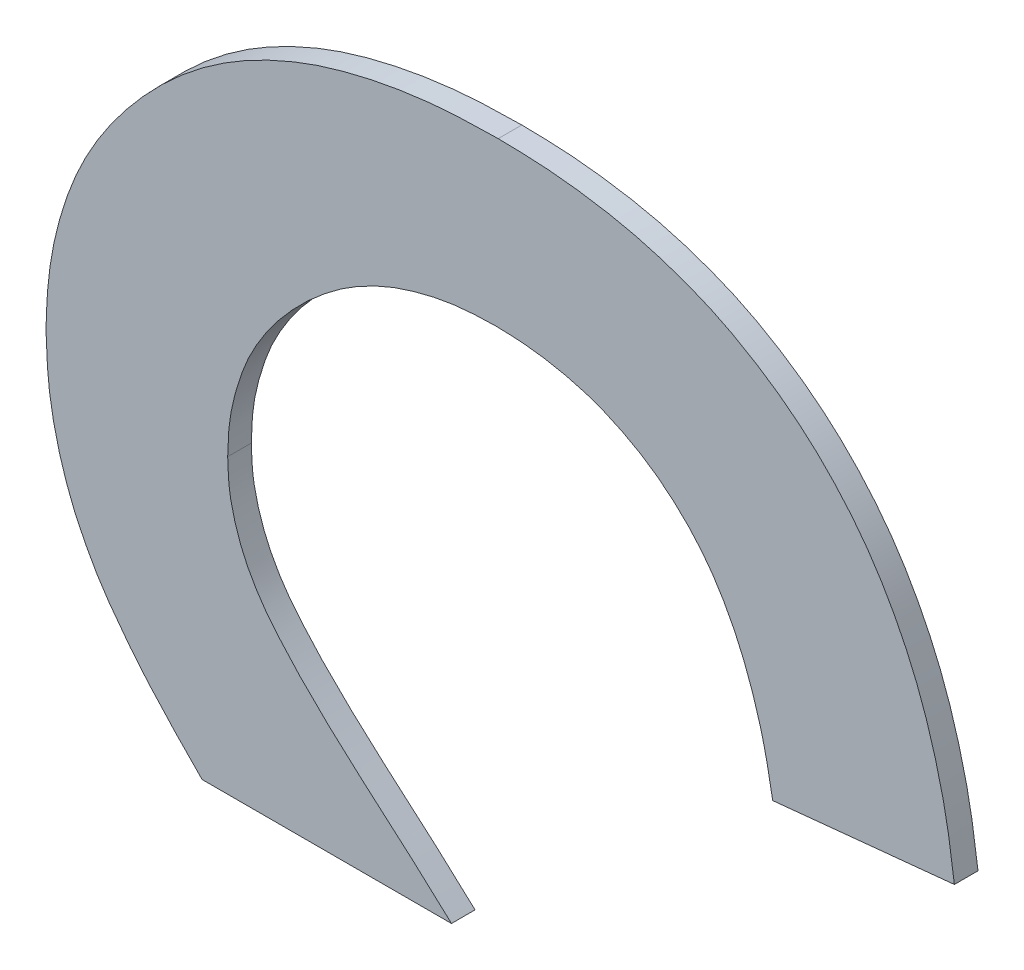
ISO-10303-21;
HEADER;
FILE_DESCRIPTION(('STEP AP214'),'2;1');
FILE_NAME('part.step','',(''),(''),'','','');
FILE_SCHEMA(('AUTOMOTIVE_DESIGN { 1 0 10303 214 1 1 1 1 }'));
ENDSEC;
DATA;
#1=APPLICATION_CONTEXT('core data for automotive mechanical design processes');
#2=APPLICATION_PROTOCOL_DEFINITION('international standard','automotive_design',2000,#1);
#3=PRODUCT_CONTEXT('',#1,'mechanical');
#4=PRODUCT('Part','Part','',(#3));
#5=PRODUCT_RELATED_PRODUCT_CATEGORY('part','',(#4));
#6=PRODUCT_DEFINITION_FORMATION('','',#4);
#7=PRODUCT_DEFINITION_CONTEXT('part definition',#1,'design');
#8=PRODUCT_DEFINITION('design','',#6,#7);
#9=PRODUCT_DEFINITION_SHAPE('','',#8);
#10=(LENGTH_UNIT() NAMED_UNIT(*) SI_UNIT(.MILLI.,.METRE.));
#11=(NAMED_UNIT(*) PLANE_ANGLE_UNIT() SI_UNIT($,.RADIAN.));
#12=(NAMED_UNIT(*) SI_UNIT($,.STERADIAN.) SOLID_ANGLE_UNIT());
#13=UNCERTAINTY_MEASURE_WITH_UNIT(LENGTH_MEASURE(1.E-05),#10,'distance_accuracy_value','');
#14=(GEOMETRIC_REPRESENTATION_CONTEXT(3) GLOBAL_UNCERTAINTY_ASSIGNED_CONTEXT((#13)) GLOBAL_UNIT_ASSIGNED_CONTEXT((#10,
#11,#12)) REPRESENTATION_CONTEXT('',''));
#15=CARTESIAN_POINT('',(0.,0.,0.));
#16=DIRECTION('',(0.,0.,1.));
#17=DIRECTION('',(1.,0.,0.));
#18=AXIS2_PLACEMENT_3D('',#15,#16,#17);
#19=CARTESIAN_POINT('',(0.174278846153862,-0.727163461538463,0.5));
#20=CARTESIAN_POINT('',(0.104379550291745,-0.648850490465537,0.5));
#21=CARTESIAN_POINT('',(-0.045742355823704,-0.480658631791847,0.5));
#22=CARTESIAN_POINT('',(-0.29113487059763,-0.215189631286869,0.5));
#23=CARTESIAN_POINT('',(-0.580472868697672,0.0706440784369072,0.5));
#24=CARTESIAN_POINT('',(-0.904826844471692,0.383369833470368,0.5));
#25=CARTESIAN_POINT('',(-1.26786361250698,0.721514611585081,0.5));
#26=CARTESIAN_POINT('',(-1.66886042913075,1.08573545993146,0.5));
#27=CARTESIAN_POINT('',(-2.10733499095428,1.47898015973117,0.5));
#28=CARTESIAN_POINT('',(-2.57996236240517,1.87862434507439,0.5));
#29=CARTESIAN_POINT('',(-3.03989044013833,2.29050165337768,0.5));
#30=CARTESIAN_POINT('',(-3.47745383321435,2.67992913892365,0.5));
#31=CARTESIAN_POINT('',(-3.86587046467265,3.05310426266962,0.5));
#32=CARTESIAN_POINT('',(-4.21554668744453,3.39885295343115,0.5));
#33=CARTESIAN_POINT('',(-4.51686073317424,3.72496446556832,0.5));
#34=CARTESIAN_POINT('',(-4.77576595325133,4.02530742447659,0.5));
#35=CARTESIAN_POINT('',(-4.99460510227963,4.29918836186116,0.5));
#36=CARTESIAN_POINT('',(-5.2191179143057,4.63819307085225,0.5));
#37=CARTESIAN_POINT('',(-5.44355125811733,5.05586246312233,0.5));
#38=CARTESIAN_POINT('',(-5.63023139592506,5.58066146372215,0.5));
#39=CARTESIAN_POINT('',(-5.75092532088114,6.12630622043596,0.5));
#40=CARTESIAN_POINT('',(-5.76308090749268,6.49976059002287,0.5));
#41=CARTESIAN_POINT('',(-5.76923076923075,6.68870192307692,0.5));
#42=B_SPLINE_CURVE_WITH_KNOTS('',3,(#19,#20,#21,#22,#23,#24,#25,#26,#27,#28,#29,#30,#31,#32,#33,
#34,#35,#36,#37,#38,#39,#40,#41),.UNSPECIFIED.,.F.,.F.,(4,1,1,1,1,1,1,1,1,1,1,1,1,1,1,1,1,1,1,1,
4),(0.,0.0322310690575655,0.0692222927768105,0.110974619220364,0.157084351643919,
0.207565065006248,0.263295960672411,0.323415696376189,0.388395141471602,0.453316340369315,
0.512978116543887,0.568228373472554,0.618679101258514,0.663944231265397,0.704506211403094,
0.740433873332112,0.771481196059508,0.829261763324265,0.885489376099478,0.942065773785035,1.),.UNSPECIFIED.);
#43=DIRECTION('',(0.,0.,-1.));
#44=VECTOR('',#43,1.);
#45=SURFACE_OF_LINEAR_EXTRUSION('',#42,#44);
#46=CARTESIAN_POINT('',(-1.030645565602,0.500000000006745,0.5));
#47=VERTEX_POINT('',#46);
#48=CARTESIAN_POINT('',(-5.76923076923075,6.68870192307692,0.5));
#49=VERTEX_POINT('',#48);
#50=EDGE_CURVE('E125',#47,#49,#42,.T.);
#51=ORIENTED_EDGE('',*,*,#50,.F.);
#52=DIRECTION('',(0.,0.,-1.));
#53=VECTOR('',#52,1.);
#54=CARTESIAN_POINT('',(-1.03064556559479,0.5,0.5));
#55=LINE('',#54,#53);
#56=CARTESIAN_POINT('',(-1.03207646711453,0.5,-1.2E-05));
#57=VERTEX_POINT('',#56);
#58=EDGE_CURVE('E57',#47,#57,#55,.T.);
#59=ORIENTED_EDGE('',*,*,#58,.T.);
#60=CARTESIAN_POINT('',(0.174278846153862,-0.727163461538463,0.));
#61=CARTESIAN_POINT('',(0.104379550291745,-0.648850490465537,0.));
#62=CARTESIAN_POINT('',(-0.045742355823704,-0.480658631791847,0.));
#63=CARTESIAN_POINT('',(-0.29113487059763,-0.215189631286869,0.));
#64=CARTESIAN_POINT('',(-0.580472868697672,0.0706440784369072,0.));
#65=CARTESIAN_POINT('',(-0.904826844471692,0.383369833470368,0.));
#66=CARTESIAN_POINT('',(-1.26786361250698,0.721514611585081,0.));
#67=CARTESIAN_POINT('',(-1.66886042913075,1.08573545993146,0.));
#68=CARTESIAN_POINT('',(-2.10733499095428,1.47898015973117,0.));
#69=CARTESIAN_POINT('',(-2.57996236240517,1.87862434507439,0.));
#70=CARTESIAN_POINT('',(-3.03989044013833,2.29050165337768,0.));
#71=CARTESIAN_POINT('',(-3.47745383321435,2.67992913892365,0.));
#72=CARTESIAN_POINT('',(-3.86587046467265,3.05310426266962,0.));
#73=CARTESIAN_POINT('',(-4.21554668744453,3.39885295343115,0.));
#74=CARTESIAN_POINT('',(-4.51686073317424,3.72496446556832,0.));
#75=CARTESIAN_POINT('',(-4.77576595325133,4.02530742447659,0.));
#76=CARTESIAN_POINT('',(-4.99460510227963,4.29918836186116,0.));
#77=CARTESIAN_POINT('',(-5.2191179143057,4.63819307085225,0.));
#78=CARTESIAN_POINT('',(-5.44355125811733,5.05586246312233,0.));
#79=CARTESIAN_POINT('',(-5.63023139592506,5.58066146372215,0.));
#80=CARTESIAN_POINT('',(-5.75092532088114,6.12630622043596,0.));
#81=CARTESIAN_POINT('',(-5.76308090749268,6.49976059002287,0.));
#82=CARTESIAN_POINT('',(-5.76923076923075,6.68870192307692,0.));
#83=B_SPLINE_CURVE_WITH_KNOTS('',3,(#60,#61,#62,#63,#64,#65,#66,#67,#68,#69,#70,#71,#72,#73,#74,
#75,#76,#77,#78,#79,#80,#81,#82),.UNSPECIFIED.,.F.,.F.,(4,1,1,1,1,1,1,1,1,1,1,1,1,1,1,1,1,1,1,1,
4),(0.,0.0322310690575655,0.0692222927768105,0.110974619220364,0.157084351643919,
0.207565065006248,0.263295960672411,0.323415696376189,0.388395141471602,0.453316340369315,
0.512978116543887,0.568228373472554,0.618679101258514,0.663944231265397,0.704506211403094,
0.740433873332112,0.771481196059508,0.829261763324265,0.885489376099478,0.942065773785035,1.),.UNSPECIFIED.);
#84=CARTESIAN_POINT('',(-5.76923076923075,6.68870192307692,0.));
#85=VERTEX_POINT('',#84);
#86=EDGE_CURVE('E114',#57,#85,#83,.T.);
#87=ORIENTED_EDGE('',*,*,#86,.T.);
#88=DIRECTION('',(0.,0.,-1.));
#89=VECTOR('',#88,1.);
#90=CARTESIAN_POINT('',(-5.76923076923075,6.68870192307692,0.5));
#91=LINE('',#90,#89);
#92=EDGE_CURVE('E137',#49,#85,#91,.T.);
#93=ORIENTED_EDGE('',*,*,#92,.F.);
#94=EDGE_LOOP('',(#51,#59,#87,#93));
#95=FACE_BOUND('',#94,.T.);
#96=ADVANCED_FACE('F39',(#95),#45,.F.);
#97=CARTESIAN_POINT('',(-9.6153846153846,7.08533653846154,0.5));
#98=CARTESIAN_POINT('',(-9.60389301856012,6.75797579590921,0.5));
#99=CARTESIAN_POINT('',(-9.58123590042242,6.11254321321944,0.5));
#100=CARTESIAN_POINT('',(-9.39918084325723,5.16596193693734,0.5));
#101=CARTESIAN_POINT('',(-9.11340108879337,4.25680371032432,0.5));
#102=CARTESIAN_POINT('',(-8.7639340038743,3.53368819405655,0.5));
#103=CARTESIAN_POINT('',(-8.42372985010389,2.95682003936723,0.5));
#104=CARTESIAN_POINT('',(-8.09929652395903,2.50973408455943,0.5));
#105=CARTESIAN_POINT('',(-7.73327862909316,2.0308320673421,0.5));
#106=CARTESIAN_POINT('',(-7.30446324529288,1.53271603087338,0.5));
#107=CARTESIAN_POINT('',(-6.81678447837605,1.01401065917077,0.5));
#108=CARTESIAN_POINT('',(-6.28127267708572,0.463462546866536,0.5));
#109=CARTESIAN_POINT('',(-5.68757216973112,-0.105316940384008,0.5));
#110=CARTESIAN_POINT('',(-5.26553019510752,-0.48398254488782,0.5));
#111=CARTESIAN_POINT('',(-5.04807692307691,-0.67908653846154,0.5));
#112=B_SPLINE_CURVE_WITH_KNOTS('',3,(#97,#98,#99,#100,#101,#102,#103,#104,#105,#106,#107,#108,
#109,#110,#111),.UNSPECIFIED.,.F.,.F.,(4,1,1,1,1,1,1,1,1,1,1,1,4),(0.,0.105240132868083,
0.207494063674428,0.308987716506333,0.411030235834405,0.465074341040456,0.524257047302949,
0.588577825583629,0.658965763752887,0.73556935018822,0.817597390457212,0.906018721698534,1.),.UNSPECIFIED.);
#113=DIRECTION('',(0.,0.,-1.));
#114=VECTOR('',#113,1.);
#115=SURFACE_OF_LINEAR_EXTRUSION('',#112,#114);
#116=CARTESIAN_POINT('',(-9.6153846153846,7.08533653846154,0.));
#117=CARTESIAN_POINT('',(-9.60389301856012,6.75797579590921,0.));
#118=CARTESIAN_POINT('',(-9.58123590042242,6.11254321321944,0.));
#119=CARTESIAN_POINT('',(-9.39918084325723,5.16596193693734,0.));
#120=CARTESIAN_POINT('',(-9.11340108879337,4.25680371032432,0.));
#121=CARTESIAN_POINT('',(-8.7639340038743,3.53368819405655,0.));
#122=CARTESIAN_POINT('',(-8.42372985010389,2.95682003936723,0.));
#123=CARTESIAN_POINT('',(-8.09929652395903,2.50973408455943,0.));
#124=CARTESIAN_POINT('',(-7.73327862909316,2.0308320673421,0.));
#125=CARTESIAN_POINT('',(-7.30446324529288,1.53271603087338,0.));
#126=CARTESIAN_POINT('',(-6.81678447837605,1.01401065917077,0.));
#127=CARTESIAN_POINT('',(-6.28127267708572,0.463462546866536,0.));
#128=CARTESIAN_POINT('',(-5.68757216973112,-0.105316940384008,0.));
#129=CARTESIAN_POINT('',(-5.26553019510752,-0.48398254488782,0.));
#130=CARTESIAN_POINT('',(-5.04807692307691,-0.67908653846154,0.));
#131=B_SPLINE_CURVE_WITH_KNOTS('',3,(#116,#117,#118,#119,#120,#121,#122,#123,#124,#125,#126,
#127,#128,#129,#130),.UNSPECIFIED.,.F.,.F.,(4,1,1,1,1,1,1,1,1,1,1,1,4),(0.,0.105240132868083,
0.207494063674428,0.308987716506333,0.411030235834405,0.465074341040456,0.524257047302949,
0.588577825583629,0.658965763752887,0.73556935018822,0.817597390457212,0.906018721698534,1.),.UNSPECIFIED.);
#132=CARTESIAN_POINT('',(-9.6153846153846,7.08533653846154,0.));
#133=VERTEX_POINT('',#132);
#134=CARTESIAN_POINT('',(-6.31139575756182,0.50000000013606,0.));
#135=VERTEX_POINT('',#134);
#136=EDGE_CURVE('E109',#133,#135,#131,.T.);
#137=ORIENTED_EDGE('',*,*,#136,.T.);
#138=DIRECTION('',(0.,0.,-1.));
#139=VECTOR('',#138,1.);
#140=CARTESIAN_POINT('',(-6.31139575742523,0.500000000000001,0.5));
#141=LINE('',#140,#139);
#142=CARTESIAN_POINT('',(-6.31139576715313,0.5,0.5));
#143=VERTEX_POINT('',#142);
#144=EDGE_CURVE('E98',#135,#143,#141,.F.);
#145=ORIENTED_EDGE('',*,*,#144,.T.);
#146=CARTESIAN_POINT('',(-9.6153846153846,7.08533653846154,0.5));
#147=VERTEX_POINT('',#146);
#148=EDGE_CURVE('E159',#147,#143,#112,.T.);
#149=ORIENTED_EDGE('',*,*,#148,.F.);
#150=DIRECTION('',(0.,0.,-1.));
#151=VECTOR('',#150,1.);
#152=CARTESIAN_POINT('',(-9.6153846153846,7.08533653846154,0.5));
#153=LINE('',#152,#151);
#154=EDGE_CURVE('E107',#147,#133,#153,.T.);
#155=ORIENTED_EDGE('',*,*,#154,.T.);
#156=EDGE_LOOP('',(#137,#145,#149,#155));
#157=FACE_BOUND('',#156,.T.);
#158=ADVANCED_FACE('F117',(#157),#115,.F.);
#159=CARTESIAN_POINT('',(2.31824117430215,-7.51504795191898,0.5));
#160=DIRECTION('',(0.,0.,-1.));
#161=DIRECTION('',(-1.,0.,0.));
#162=AXIS2_PLACEMENT_3D('',#159,#160,#161);
#163=PLANE('',#162);
#164=ORIENTED_EDGE('',*,*,#148,.T.);
#165=DIRECTION('',(1.,0.,0.));
#166=VECTOR('',#165,1.);
#167=CARTESIAN_POINT('',(2.31824117430215,0.5,0.5));
#168=LINE('',#167,#166);
#169=EDGE_CURVE('E100',#143,#47,#168,.T.);
#170=ORIENTED_EDGE('',*,*,#169,.T.);
#171=ORIENTED_EDGE('',*,*,#50,.T.);
#172=CARTESIAN_POINT('',(-5.76923076923075,6.68870192307692,0.5));
#173=CARTESIAN_POINT('',(-5.76499445072017,6.85923651896681,0.5));
#174=CARTESIAN_POINT('',(-5.75657568797945,7.19813698131264,0.5));
#175=CARTESIAN_POINT('',(-5.6773299264536,7.69868502582694,0.5));
#176=CARTESIAN_POINT('',(-5.53986574416502,8.18108026741351,0.5));
#177=CARTESIAN_POINT('',(-5.37097072310344,8.65529391743084,0.5));
#178=CARTESIAN_POINT('',(-5.13070691107866,9.1046852550422,0.5));
#179=CARTESIAN_POINT('',(-4.84872211808945,9.54203419158652,0.5));
#180=CARTESIAN_POINT('',(-4.50662643661528,9.95559846723119,0.5));
#181=CARTESIAN_POINT('',(-4.12887019564824,10.355654213448,0.5));
#182=CARTESIAN_POINT('',(-3.70816974683161,10.7189106849549,0.5));
#183=CARTESIAN_POINT('',(-3.2658051897926,11.0470715003547,0.5));
#184=CARTESIAN_POINT('',(-2.79232836596225,11.3172731596572,0.5));
#185=CARTESIAN_POINT('',(-2.30033094032891,11.541904138101,0.5));
#186=CARTESIAN_POINT('',(-1.78108304009906,11.7091739677415,0.5));
#187=CARTESIAN_POINT('',(-1.24320751784083,11.8371261160201,0.5));
#188=CARTESIAN_POINT('',(-0.679051993381878,11.9094747541895,0.5));
#189=CARTESIAN_POINT('',(-0.296671164383505,11.9184907223155,0.5));
#190=CARTESIAN_POINT('',(-0.102163461538445,11.9230769230769,0.5));
#191=B_SPLINE_CURVE_WITH_KNOTS('',3,(#172,#173,#174,#175,#176,#177,#178,#179,#180,#181,#182,
#183,#184,#185,#186,#187,#188,#189,#190),.UNSPECIFIED.,.F.,.F.,(4,1,1,1,1,1,1,1,1,1,1,1,1,1,1,1,
4),(0.,0.0597335100362246,0.118707374671867,0.176949765248526,0.235365339513343,
0.294705711920404,0.355062916124958,0.417443556767029,0.482484811582578,0.547662294449013,
0.61196829489403,0.675180714136056,0.738330739858383,0.801152182939625,0.866026548326181,
0.931851007291453,1.),.UNSPECIFIED.);
#192=CARTESIAN_POINT('',(-0.102163461538445,11.9230769230769,0.5));
#193=VERTEX_POINT('',#192);
#194=EDGE_CURVE('E224',#49,#193,#191,.T.);
#195=ORIENTED_EDGE('',*,*,#194,.T.);
#196=CARTESIAN_POINT('',(-0.102163461538445,11.9230769230769,0.5));
#197=CARTESIAN_POINT('',(0.0863335085181369,11.9181935412096,0.5));
#198=CARTESIAN_POINT('',(0.456484909274226,11.9086040468105,0.5));
#199=CARTESIAN_POINT('',(0.999328220928699,11.8410349309217,0.5));
#200=CARTESIAN_POINT('',(1.5180082613629,11.7330314933076,0.5));
#201=CARTESIAN_POINT('',(2.01467632224154,11.5845029585255,0.5));
#202=CARTESIAN_POINT('',(2.48545612525305,11.3820044825451,0.5));
#203=CARTESIAN_POINT('',(2.93608676550452,11.1442966859808,0.5));
#204=CARTESIAN_POINT('',(3.36130778743654,10.85856628369,0.5));
#205=CARTESIAN_POINT('',(3.7573020071203,10.5275738696885,0.5));
#206=CARTESIAN_POINT('',(4.12667319798236,10.1521694732082,0.5));
#207=CARTESIAN_POINT('',(4.46676081429759,9.72971212164258,0.5));
#208=CARTESIAN_POINT('',(4.76436184679833,9.25059928344032,0.5));
#209=CARTESIAN_POINT('',(5.03687831990061,8.72742807653071,0.5));
#210=CARTESIAN_POINT('',(5.26868212190881,8.1524368182905,0.5));
#211=CARTESIAN_POINT('',(5.47415372060769,7.53289392075175,0.5));
#212=CARTESIAN_POINT('',(5.64208272104682,6.8614761813834,0.5));
#213=CARTESIAN_POINT('',(5.72593779970957,6.39478894181677,0.5));
#214=CARTESIAN_POINT('',(5.76923076923079,6.15384615384615,0.5));
#215=B_SPLINE_CURVE_WITH_KNOTS('',3,(#196,#197,#198,#199,#200,#201,#202,#203,#204,#205,#206,
#207,#208,#209,#210,#211,#212,#213,#214),.UNSPECIFIED.,.F.,.F.,(4,1,1,1,1,1,1,1,1,1,1,1,1,1,1,1,
4),(0.,0.0621371958572539,0.12201877875657,0.180047045394859,0.236663813092713,
0.292598519541828,0.348735606608627,0.404420219502886,0.461160117464861,0.518602892718021,
0.577806873887764,0.639553254822151,0.7042423095222,0.772064971475395,0.843700243358365,
0.919305059295527,1.),.UNSPECIFIED.);
#216=CARTESIAN_POINT('',(5.76923076923079,6.15384615384615,0.5));
#217=VERTEX_POINT('',#216);
#218=EDGE_CURVE('E229',#193,#217,#215,.T.);
#219=ORIENTED_EDGE('',*,*,#218,.T.);
#220=DIRECTION('',(0.995037190209989,0.0995037190209984,0.));
#221=VECTOR('',#220,1.);
#222=CARTESIAN_POINT('',(5.76923076923079,6.15384615384615,0.5));
#223=LINE('',#222,#221);
#224=CARTESIAN_POINT('',(9.61538461538463,6.53846153846154,0.5));
#225=VERTEX_POINT('',#224);
#226=EDGE_CURVE('E267',#217,#225,#223,.T.);
#227=ORIENTED_EDGE('',*,*,#226,.T.);
#228=CARTESIAN_POINT('',(9.61538461538463,6.53846153846154,0.5));
#229=CARTESIAN_POINT('',(9.56880194178485,6.8859656221147,0.5));
#230=CARTESIAN_POINT('',(9.47771251884075,7.56548751307881,0.5));
#231=CARTESIAN_POINT('',(9.25181327944031,8.5450854921351,0.5));
#232=CARTESIAN_POINT('',(8.97173406377024,9.46508195644433,0.5));
#233=CARTESIAN_POINT('',(8.6231473324998,10.3198364075626,0.5));
#234=CARTESIAN_POINT('',(8.21208754959116,11.1118824324534,0.5));
#235=CARTESIAN_POINT('',(7.74470586501921,11.84464907833,0.5));
#236=CARTESIAN_POINT('',(7.20445757134174,12.5077778812531,0.5));
#237=CARTESIAN_POINT('',(6.60894395525875,13.1122622469242,0.5));
#238=CARTESIAN_POINT('',(5.95319306743313,13.6470303077099,0.5));
#239=CARTESIAN_POINT('',(5.24458926309744,14.1105133555988,0.5));
#240=CARTESIAN_POINT('',(4.49142803965914,14.5133755786941,0.5));
#241=CARTESIAN_POINT('',(3.67826648104101,14.8280069052076,0.5));
#242=CARTESIAN_POINT('',(2.82095807211139,15.0833764835467,0.5));
#243=CARTESIAN_POINT('',(1.91031000810549,15.2529149581767,0.5));
#244=CARTESIAN_POINT('',(0.952366272231204,15.3658239455645,0.5));
#245=CARTESIAN_POINT('',(0.294815604000249,15.3782494343597,0.5));
#246=CARTESIAN_POINT('',(-0.0420673076922916,15.3846153846154,0.5));
#247=B_SPLINE_CURVE_WITH_KNOTS('',3,(#228,#229,#230,#231,#232,#233,#234,#235,#236,#237,#238,
#239,#240,#241,#242,#243,#244,#245,#246),.UNSPECIFIED.,.F.,.F.,(4,1,1,1,1,1,1,1,1,1,1,1,1,1,1,1,
4),(0.,0.0721554068126816,0.141095258407308,0.206716508159026,0.269981753042115,
0.330858504571412,0.390235737820875,0.448595776423081,0.506634285770791,0.564674260644902,
0.622443952733772,0.68074566336318,0.740180169095935,0.801652020869351,0.864665348844649,
0.930664002734926,1.),.UNSPECIFIED.);
#248=CARTESIAN_POINT('',(-0.0420673076922916,15.3846153846154,0.5));
#249=VERTEX_POINT('',#248);
#250=EDGE_CURVE('E189',#225,#249,#247,.T.);
#251=ORIENTED_EDGE('',*,*,#250,.T.);
#252=CARTESIAN_POINT('',(-0.0420673076922916,15.3846153846154,0.5));
#253=CARTESIAN_POINT('',(-0.396941435036188,15.3784303317762,0.5));
#254=CARTESIAN_POINT('',(-1.09059792306271,15.3663406873076,0.5));
#255=CARTESIAN_POINT('',(-2.10408059610544,15.2503847955048,0.5));
#256=CARTESIAN_POINT('',(-3.06247139378986,15.0575790364385,0.5));
#257=CARTESIAN_POINT('',(-3.96806964010669,14.7968390899357,0.5));
#258=CARTESIAN_POINT('',(-4.81395121202324,14.4503401661748,0.5));
#259=CARTESIAN_POINT('',(-5.60744770599557,14.0356256462643,0.5));
#260=CARTESIAN_POINT('',(-6.34474302862203,13.5395619746849,0.5));
#261=CARTESIAN_POINT('',(-7.0196112389849,12.9712851211741,0.5));
#262=CARTESIAN_POINT('',(-7.62307185381388,12.3473306672951,0.5));
#263=CARTESIAN_POINT('',(-8.155555371885,11.6905531379839,0.5));
#264=CARTESIAN_POINT('',(-8.60963759209539,11.0038156491206,0.5));
#265=CARTESIAN_POINT('',(-8.98087814940645,10.2832165563575,0.5));
#266=CARTESIAN_POINT('',(-9.26197366253801,9.52759955960907,0.5));
#267=CARTESIAN_POINT('',(-9.46847416016103,8.74300662718516,0.5));
#268=CARTESIAN_POINT('',(-9.59063648768828,7.92449936096861,0.5));
#269=CARTESIAN_POINT('',(-9.60704266095368,7.36819664454221,0.5));
#270=CARTESIAN_POINT('',(-9.6153846153846,7.08533653846154,0.5));
#271=B_SPLINE_CURVE_WITH_KNOTS('',3,(#252,#253,#254,#255,#256,#257,#258,#259,#260,#261,#262,
#263,#264,#265,#266,#267,#268,#269,#270),.UNSPECIFIED.,.F.,.F.,(4,1,1,1,1,1,1,1,1,1,1,1,1,1,1,1,
4),(0.,0.0750642962629259,0.146724802147849,0.215468030610114,0.281724124667236,
0.345792597238209,0.408547961989802,0.470852267159615,0.533424153065173,0.594870509189482,
0.654247147278638,0.71208501471142,0.768763575870706,0.825366015816695,0.882319663516908,
0.940163742727974,1.),.UNSPECIFIED.);
#272=EDGE_CURVE('E185',#249,#147,#271,.T.);
#273=ORIENTED_EDGE('',*,*,#272,.T.);
#274=EDGE_LOOP('',(#164,#170,#171,#195,#219,#227,#251,#273));
#275=FACE_BOUND('',#274,.T.);
#276=ADVANCED_FACE('F210',(#275),#163,.F.);
#277=DIRECTION('',(0.,0.,-1.));
#278=VECTOR('',#277,1.);
#279=SURFACE_OF_LINEAR_EXTRUSION('',#191,#278);
#280=CARTESIAN_POINT('',(-5.76923076923075,6.68870192307692,0.));
#281=CARTESIAN_POINT('',(-5.76499445072017,6.85923651896681,0.));
#282=CARTESIAN_POINT('',(-5.75657568797945,7.19813698131264,0.));
#283=CARTESIAN_POINT('',(-5.6773299264536,7.69868502582694,0.));
#284=CARTESIAN_POINT('',(-5.53986574416502,8.18108026741351,0.));
#285=CARTESIAN_POINT('',(-5.37097072310344,8.65529391743084,0.));
#286=CARTESIAN_POINT('',(-5.13070691107866,9.1046852550422,0.));
#287=CARTESIAN_POINT('',(-4.84872211808945,9.54203419158652,0.));
#288=CARTESIAN_POINT('',(-4.50662643661528,9.95559846723119,0.));
#289=CARTESIAN_POINT('',(-4.12887019564824,10.355654213448,0.));
#290=CARTESIAN_POINT('',(-3.70816974683161,10.7189106849549,0.));
#291=CARTESIAN_POINT('',(-3.2658051897926,11.0470715003547,0.));
#292=CARTESIAN_POINT('',(-2.79232836596225,11.3172731596572,0.));
#293=CARTESIAN_POINT('',(-2.30033094032891,11.541904138101,0.));
#294=CARTESIAN_POINT('',(-1.78108304009906,11.7091739677415,0.));
#295=CARTESIAN_POINT('',(-1.24320751784083,11.8371261160201,0.));
#296=CARTESIAN_POINT('',(-0.679051993381878,11.9094747541895,0.));
#297=CARTESIAN_POINT('',(-0.296671164383505,11.9184907223155,0.));
#298=CARTESIAN_POINT('',(-0.102163461538445,11.9230769230769,0.));
#299=B_SPLINE_CURVE_WITH_KNOTS('',3,(#280,#281,#282,#283,#284,#285,#286,#287,#288,#289,#290,
#291,#292,#293,#294,#295,#296,#297,#298),.UNSPECIFIED.,.F.,.F.,(4,1,1,1,1,1,1,1,1,1,1,1,1,1,1,1,
4),(0.,0.0597335100362246,0.118707374671867,0.176949765248526,0.235365339513343,
0.294705711920404,0.355062916124958,0.417443556767029,0.482484811582578,0.547662294449013,
0.61196829489403,0.675180714136056,0.738330739858383,0.801152182939625,0.866026548326181,
0.931851007291453,1.),.UNSPECIFIED.);
#300=CARTESIAN_POINT('',(-0.102163461538445,11.9230769230769,0.));
#301=VERTEX_POINT('',#300);
#302=EDGE_CURVE('E142',#85,#301,#299,.T.);
#303=ORIENTED_EDGE('',*,*,#302,.T.);
#304=DIRECTION('',(0.,0.,-1.));
#305=VECTOR('',#304,1.);
#306=CARTESIAN_POINT('',(-0.102163461538445,11.9230769230769,0.5));
#307=LINE('',#306,#305);
#308=EDGE_CURVE('E143',#193,#301,#307,.T.);
#309=ORIENTED_EDGE('',*,*,#308,.F.);
#310=ORIENTED_EDGE('',*,*,#194,.F.);
#311=ORIENTED_EDGE('',*,*,#92,.T.);
#312=EDGE_LOOP('',(#303,#309,#310,#311));
#313=FACE_BOUND('',#312,.T.);
#314=ADVANCED_FACE('F213',(#313),#279,.F.);
#315=DIRECTION('',(0.,0.,-1.));
#316=VECTOR('',#315,1.);
#317=SURFACE_OF_LINEAR_EXTRUSION('',#215,#316);
#318=CARTESIAN_POINT('',(-0.102163461538445,11.9230769230769,0.));
#319=CARTESIAN_POINT('',(0.0863335085181369,11.9181935412096,0.));
#320=CARTESIAN_POINT('',(0.456484909274226,11.9086040468105,0.));
#321=CARTESIAN_POINT('',(0.999328220928699,11.8410349309217,0.));
#322=CARTESIAN_POINT('',(1.5180082613629,11.7330314933076,0.));
#323=CARTESIAN_POINT('',(2.01467632224154,11.5845029585255,0.));
#324=CARTESIAN_POINT('',(2.48545612525305,11.3820044825451,0.));
#325=CARTESIAN_POINT('',(2.93608676550452,11.1442966859808,0.));
#326=CARTESIAN_POINT('',(3.36130778743654,10.85856628369,0.));
#327=CARTESIAN_POINT('',(3.7573020071203,10.5275738696885,0.));
#328=CARTESIAN_POINT('',(4.12667319798236,10.1521694732082,0.));
#329=CARTESIAN_POINT('',(4.46676081429759,9.72971212164258,0.));
#330=CARTESIAN_POINT('',(4.76436184679833,9.25059928344032,0.));
#331=CARTESIAN_POINT('',(5.03687831990061,8.72742807653071,0.));
#332=CARTESIAN_POINT('',(5.26868212190881,8.1524368182905,0.));
#333=CARTESIAN_POINT('',(5.47415372060769,7.53289392075175,0.));
#334=CARTESIAN_POINT('',(5.64208272104682,6.8614761813834,0.));
#335=CARTESIAN_POINT('',(5.72593779970957,6.39478894181677,0.));
#336=CARTESIAN_POINT('',(5.76923076923079,6.15384615384615,0.));
#337=B_SPLINE_CURVE_WITH_KNOTS('',3,(#318,#319,#320,#321,#322,#323,#324,#325,#326,#327,#328,
#329,#330,#331,#332,#333,#334,#335,#336),.UNSPECIFIED.,.F.,.F.,(4,1,1,1,1,1,1,1,1,1,1,1,1,1,1,1,
4),(0.,0.0621371958572539,0.12201877875657,0.180047045394859,0.236663813092713,
0.292598519541828,0.348735606608627,0.404420219502886,0.461160117464861,0.518602892718021,
0.577806873887764,0.639553254822151,0.7042423095222,0.772064971475395,0.843700243358365,
0.919305059295527,1.),.UNSPECIFIED.);
#338=CARTESIAN_POINT('',(5.76923076923079,6.15384615384615,0.));
#339=VERTEX_POINT('',#338);
#340=EDGE_CURVE('E145',#301,#339,#337,.T.);
#341=ORIENTED_EDGE('',*,*,#340,.T.);
#342=DIRECTION('',(0.,0.,-1.));
#343=VECTOR('',#342,1.);
#344=CARTESIAN_POINT('',(5.76923076923079,6.15384615384615,0.5));
#345=LINE('',#344,#343);
#346=EDGE_CURVE('E149',#217,#339,#345,.T.);
#347=ORIENTED_EDGE('',*,*,#346,.F.);
#348=ORIENTED_EDGE('',*,*,#218,.F.);
#349=ORIENTED_EDGE('',*,*,#308,.T.);
#350=EDGE_LOOP('',(#341,#347,#348,#349));
#351=FACE_BOUND('',#350,.T.);
#352=ADVANCED_FACE('F238',(#351),#317,.F.);
#353=CARTESIAN_POINT('',(5.76923076923079,6.15384615384615,0.5));
#354=DIRECTION('',(-0.0995037190209984,0.995037190209989,0.));
#355=DIRECTION('',(-0.995037190209989,-0.0995037190209984,0.));
#356=AXIS2_PLACEMENT_3D('',#353,#354,#355);
#357=PLANE('',#356);
#358=DIRECTION('',(0.995037190209989,0.0995037190209984,0.));
#359=VECTOR('',#358,1.);
#360=CARTESIAN_POINT('',(5.76923076923079,6.15384615384615,0.));
#361=LINE('',#360,#359);
#362=CARTESIAN_POINT('',(9.61538461538463,6.53846153846154,0.));
#363=VERTEX_POINT('',#362);
#364=EDGE_CURVE('E150',#339,#363,#361,.T.);
#365=ORIENTED_EDGE('',*,*,#364,.T.);
#366=DIRECTION('',(0.,0.,-1.));
#367=VECTOR('',#366,1.);
#368=CARTESIAN_POINT('',(9.61538461538463,6.53846153846154,0.5));
#369=LINE('',#368,#367);
#370=EDGE_CURVE('E154',#225,#363,#369,.T.);
#371=ORIENTED_EDGE('',*,*,#370,.F.);
#372=ORIENTED_EDGE('',*,*,#226,.F.);
#373=ORIENTED_EDGE('',*,*,#346,.T.);
#374=EDGE_LOOP('',(#365,#371,#372,#373));
#375=FACE_BOUND('',#374,.T.);
#376=ADVANCED_FACE('F245',(#375),#357,.F.);
#377=DIRECTION('',(0.,0.,-1.));
#378=VECTOR('',#377,1.);
#379=SURFACE_OF_LINEAR_EXTRUSION('',#247,#378);
#380=CARTESIAN_POINT('',(9.61538461538463,6.53846153846154,0.));
#381=CARTESIAN_POINT('',(9.56880194178485,6.8859656221147,0.));
#382=CARTESIAN_POINT('',(9.47771251884075,7.56548751307881,0.));
#383=CARTESIAN_POINT('',(9.25181327944031,8.5450854921351,0.));
#384=CARTESIAN_POINT('',(8.97173406377024,9.46508195644433,0.));
#385=CARTESIAN_POINT('',(8.6231473324998,10.3198364075626,0.));
#386=CARTESIAN_POINT('',(8.21208754959116,11.1118824324534,0.));
#387=CARTESIAN_POINT('',(7.74470586501921,11.84464907833,0.));
#388=CARTESIAN_POINT('',(7.20445757134174,12.5077778812531,0.));
#389=CARTESIAN_POINT('',(6.60894395525875,13.1122622469242,0.));
#390=CARTESIAN_POINT('',(5.95319306743313,13.6470303077099,0.));
#391=CARTESIAN_POINT('',(5.24458926309744,14.1105133555988,0.));
#392=CARTESIAN_POINT('',(4.49142803965914,14.5133755786941,0.));
#393=CARTESIAN_POINT('',(3.67826648104101,14.8280069052076,0.));
#394=CARTESIAN_POINT('',(2.82095807211139,15.0833764835467,0.));
#395=CARTESIAN_POINT('',(1.91031000810549,15.2529149581767,0.));
#396=CARTESIAN_POINT('',(0.952366272231204,15.3658239455645,0.));
#397=CARTESIAN_POINT('',(0.294815604000249,15.3782494343597,0.));
#398=CARTESIAN_POINT('',(-0.0420673076922916,15.3846153846154,0.));
#399=B_SPLINE_CURVE_WITH_KNOTS('',3,(#380,#381,#382,#383,#384,#385,#386,#387,#388,#389,#390,
#391,#392,#393,#394,#395,#396,#397,#398),.UNSPECIFIED.,.F.,.F.,(4,1,1,1,1,1,1,1,1,1,1,1,1,1,1,1,
4),(0.,0.0721554068126816,0.141095258407308,0.206716508159026,0.269981753042115,
0.330858504571412,0.390235737820875,0.448595776423081,0.506634285770791,0.564674260644902,
0.622443952733772,0.68074566336318,0.740180169095935,0.801652020869351,0.864665348844649,
0.930664002734926,1.),.UNSPECIFIED.);
#400=CARTESIAN_POINT('',(-0.0420673076922916,15.3846153846154,0.));
#401=VERTEX_POINT('',#400);
#402=EDGE_CURVE('E152',#363,#401,#399,.T.);
#403=ORIENTED_EDGE('',*,*,#402,.T.);
#404=DIRECTION('',(0.,0.,-1.));
#405=VECTOR('',#404,1.);
#406=CARTESIAN_POINT('',(-0.0420673076922916,15.3846153846154,0.5));
#407=LINE('',#406,#405);
#408=EDGE_CURVE('E47',#249,#401,#407,.T.);
#409=ORIENTED_EDGE('',*,*,#408,.F.);
#410=ORIENTED_EDGE('',*,*,#250,.F.);
#411=ORIENTED_EDGE('',*,*,#370,.T.);
#412=EDGE_LOOP('',(#403,#409,#410,#411));
#413=FACE_BOUND('',#412,.T.);
#414=ADVANCED_FACE('F201',(#413),#379,.F.);
#415=DIRECTION('',(0.,0.,-1.));
#416=VECTOR('',#415,1.);
#417=SURFACE_OF_LINEAR_EXTRUSION('',#271,#416);
#418=CARTESIAN_POINT('',(-0.0420673076922916,15.3846153846154,0.));
#419=CARTESIAN_POINT('',(-0.396941435036188,15.3784303317762,0.));
#420=CARTESIAN_POINT('',(-1.09059792306271,15.3663406873076,0.));
#421=CARTESIAN_POINT('',(-2.10408059610544,15.2503847955048,0.));
#422=CARTESIAN_POINT('',(-3.06247139378986,15.0575790364385,0.));
#423=CARTESIAN_POINT('',(-3.96806964010669,14.7968390899357,0.));
#424=CARTESIAN_POINT('',(-4.81395121202324,14.4503401661748,0.));
#425=CARTESIAN_POINT('',(-5.60744770599557,14.0356256462643,0.));
#426=CARTESIAN_POINT('',(-6.34474302862203,13.5395619746849,0.));
#427=CARTESIAN_POINT('',(-7.0196112389849,12.9712851211741,0.));
#428=CARTESIAN_POINT('',(-7.62307185381388,12.3473306672951,0.));
#429=CARTESIAN_POINT('',(-8.155555371885,11.6905531379839,0.));
#430=CARTESIAN_POINT('',(-8.60963759209539,11.0038156491206,0.));
#431=CARTESIAN_POINT('',(-8.98087814940645,10.2832165563575,0.));
#432=CARTESIAN_POINT('',(-9.26197366253801,9.52759955960907,0.));
#433=CARTESIAN_POINT('',(-9.46847416016103,8.74300662718516,0.));
#434=CARTESIAN_POINT('',(-9.59063648768828,7.92449936096861,0.));
#435=CARTESIAN_POINT('',(-9.60704266095368,7.36819664454221,0.));
#436=CARTESIAN_POINT('',(-9.6153846153846,7.08533653846154,0.));
#437=B_SPLINE_CURVE_WITH_KNOTS('',3,(#418,#419,#420,#421,#422,#423,#424,#425,#426,#427,#428,
#429,#430,#431,#432,#433,#434,#435,#436),.UNSPECIFIED.,.F.,.F.,(4,1,1,1,1,1,1,1,1,1,1,1,1,1,1,1,
4),(0.,0.0750642962629259,0.146724802147849,0.215468030610114,0.281724124667236,
0.345792597238209,0.408547961989802,0.470852267159615,0.533424153065173,0.594870509189482,
0.654247147278638,0.71208501471142,0.768763575870706,0.825366015816695,0.882319663516908,
0.940163742727974,1.),.UNSPECIFIED.);
#438=EDGE_CURVE('E153',#401,#133,#437,.T.);
#439=ORIENTED_EDGE('',*,*,#438,.T.);
#440=ORIENTED_EDGE('',*,*,#154,.F.);
#441=ORIENTED_EDGE('',*,*,#272,.F.);
#442=ORIENTED_EDGE('',*,*,#408,.T.);
#443=EDGE_LOOP('',(#439,#440,#441,#442));
#444=FACE_BOUND('',#443,.T.);
#445=ADVANCED_FACE('F196',(#444),#417,.F.);
#446=CARTESIAN_POINT('',(2.31824117430215,-7.51504795191898,0.));
#447=DIRECTION('',(0.,0.,-1.));
#448=DIRECTION('',(-1.,0.,0.));
#449=AXIS2_PLACEMENT_3D('',#446,#447,#448);
#450=PLANE('',#449);
#451=DIRECTION('',(1.,0.,0.));
#452=VECTOR('',#451,1.);
#453=CARTESIAN_POINT('',(2.31824117430215,0.5,0.));
#454=LINE('',#453,#452);
#455=EDGE_CURVE('E11',#135,#57,#454,.T.);
#456=ORIENTED_EDGE('',*,*,#455,.F.);
#457=ORIENTED_EDGE('',*,*,#136,.F.);
#458=ORIENTED_EDGE('',*,*,#438,.F.);
#459=ORIENTED_EDGE('',*,*,#402,.F.);
#460=ORIENTED_EDGE('',*,*,#364,.F.);
#461=ORIENTED_EDGE('',*,*,#340,.F.);
#462=ORIENTED_EDGE('',*,*,#302,.F.);
#463=ORIENTED_EDGE('',*,*,#86,.F.);
#464=EDGE_LOOP('',(#456,#457,#458,#459,#460,#461,#462,#463));
#465=FACE_BOUND('',#464,.T.);
#466=ADVANCED_FACE('F41',(#465),#450,.T.);
#467=CARTESIAN_POINT('',(-17.,0.5,1.));
#468=DIRECTION('',(0.,1.,0.));
#469=DIRECTION('',(0.,0.,1.));
#470=AXIS2_PLACEMENT_3D('',#467,#468,#469);
#471=PLANE('',#470);
#472=ORIENTED_EDGE('',*,*,#169,.F.);
#473=ORIENTED_EDGE('',*,*,#144,.F.);
#474=ORIENTED_EDGE('',*,*,#455,.T.);
#475=ORIENTED_EDGE('',*,*,#58,.F.);
#476=EDGE_LOOP('',(#472,#473,#474,#475));
#477=FACE_BOUND('',#476,.T.);
#478=ADVANCED_FACE('F102',(#477),#471,.F.);
#479=CLOSED_SHELL('',(#96,#158,#276,#314,#352,#376,#414,#445,#466,#478));
#480=MANIFOLD_SOLID_BREP('B2',#479);
#481=ADVANCED_BREP_SHAPE_REPRESENTATION('',(#18,#480),#14);
#482=SHAPE_DEFINITION_REPRESENTATION(#9,#481);
ENDSEC;
END-ISO-10303-21;
